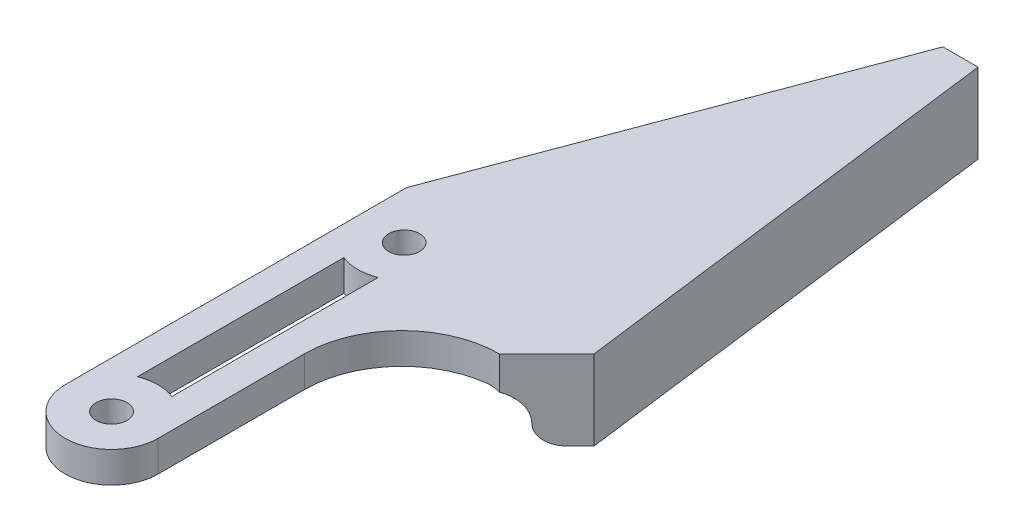
ISO-10303-21;
HEADER;
FILE_DESCRIPTION(('STEP AP214'),'2;1');
FILE_NAME('part.step','',(''),(''),'','','');
FILE_SCHEMA(('AUTOMOTIVE_DESIGN { 1 0 10303 214 1 1 1 1 }'));
ENDSEC;
DATA;
#1=APPLICATION_CONTEXT('core data for automotive mechanical design processes');
#2=APPLICATION_PROTOCOL_DEFINITION('international standard','automotive_design',2000,#1);
#3=PRODUCT_CONTEXT('',#1,'mechanical');
#4=PRODUCT('Part','Part','',(#3));
#5=PRODUCT_RELATED_PRODUCT_CATEGORY('part','',(#4));
#6=PRODUCT_DEFINITION_FORMATION('','',#4);
#7=PRODUCT_DEFINITION_CONTEXT('part definition',#1,'design');
#8=PRODUCT_DEFINITION('design','',#6,#7);
#9=PRODUCT_DEFINITION_SHAPE('','',#8);
#10=(LENGTH_UNIT() NAMED_UNIT(*) SI_UNIT(.MILLI.,.METRE.));
#11=(NAMED_UNIT(*) PLANE_ANGLE_UNIT() SI_UNIT($,.RADIAN.));
#12=(NAMED_UNIT(*) SI_UNIT($,.STERADIAN.) SOLID_ANGLE_UNIT());
#13=UNCERTAINTY_MEASURE_WITH_UNIT(LENGTH_MEASURE(1.E-05),#10,'distance_accuracy_value','');
#14=(GEOMETRIC_REPRESENTATION_CONTEXT(3) GLOBAL_UNCERTAINTY_ASSIGNED_CONTEXT((#13)) GLOBAL_UNIT_ASSIGNED_CONTEXT((#10,
#11,#12)) REPRESENTATION_CONTEXT('',''));
#15=CARTESIAN_POINT('',(0.,0.,0.));
#16=DIRECTION('',(0.,0.,1.));
#17=DIRECTION('',(1.,0.,0.));
#18=AXIS2_PLACEMENT_3D('',#15,#16,#17);
#19=CARTESIAN_POINT('',(7.025,3.175,20.));
#20=DIRECTION('',(0.,-1.,0.));
#21=DIRECTION('',(0.,0.,-1.));
#22=AXIS2_PLACEMENT_3D('',#19,#20,#21);
#23=PLANE('',#22);
#24=CARTESIAN_POINT('',(-7.7375,3.175,35.));
#25=DIRECTION('',(0.,1.,0.));
#26=DIRECTION('',(0.,0.,1.));
#27=AXIS2_PLACEMENT_3D('',#24,#25,#26);
#28=CIRCLE('',#27,4.7625);
#29=CARTESIAN_POINT('',(-5.97499999999999,3.175,30.5756356388742));
#30=VERTEX_POINT('',#29);
#31=CARTESIAN_POINT('',(-9.5,3.175,30.5756356388742));
#32=VERTEX_POINT('',#31);
#33=EDGE_CURVE('E179',#30,#32,#28,.T.);
#34=ORIENTED_EDGE('',*,*,#33,.T.);
#35=DIRECTION('',(0.,0.,1.));
#36=VECTOR('',#35,1.);
#37=CARTESIAN_POINT('',(-9.5,3.175,0.));
#38=LINE('',#37,#36);
#39=CARTESIAN_POINT('',(-9.5,3.175,9.42705531363683));
#40=VERTEX_POINT('',#39);
#41=EDGE_CURVE('E188',#40,#32,#38,.T.);
#42=ORIENTED_EDGE('',*,*,#41,.F.);
#43=CARTESIAN_POINT('',(-7.7375,3.175,5.00000000000001));
#44=DIRECTION('',(0.,1.,0.));
#45=DIRECTION('',(0.,0.,1.));
#46=AXIS2_PLACEMENT_3D('',#43,#44,#45);
#47=CIRCLE('',#46,4.76499999999999);
#48=CARTESIAN_POINT('',(-5.97500000000001,3.175,9.42705531363683));
#49=VERTEX_POINT('',#48);
#50=EDGE_CURVE('E185',#40,#49,#47,.T.);
#51=ORIENTED_EDGE('',*,*,#50,.T.);
#52=DIRECTION('',(0.,0.,1.));
#53=VECTOR('',#52,1.);
#54=CARTESIAN_POINT('',(-5.975,3.175,0.));
#55=LINE('',#54,#53);
#56=EDGE_CURVE('E182',#49,#30,#55,.T.);
#57=ORIENTED_EDGE('',*,*,#56,.T.);
#58=EDGE_LOOP('',(#34,#42,#51,#57));
#59=FACE_BOUND('',#58,.T.);
#60=CARTESIAN_POINT('',(-7.7375,3.175,5.00000000000001));
#61=DIRECTION('',(0.,1.,0.));
#62=DIRECTION('',(0.,0.,1.));
#63=AXIS2_PLACEMENT_3D('',#60,#61,#62);
#64=CIRCLE('',#63,1.5875);
#65=CARTESIAN_POINT('',(-7.7375,3.175,6.58750000000001));
#66=VERTEX_POINT('',#65);
#67=EDGE_CURVE('E210',#66,#66,#64,.T.);
#68=ORIENTED_EDGE('',*,*,#67,.F.);
#69=EDGE_LOOP('',(#68));
#70=FACE_BOUND('',#69,.T.);
#71=CARTESIAN_POINT('',(-7.7375,3.175,35.));
#72=DIRECTION('',(0.,1.,0.));
#73=DIRECTION('',(0.,0.,1.));
#74=AXIS2_PLACEMENT_3D('',#71,#72,#73);
#75=CIRCLE('',#74,1.5875);
#76=CARTESIAN_POINT('',(-7.7375,3.175,36.5875));
#77=VERTEX_POINT('',#76);
#78=EDGE_CURVE('E204',#77,#77,#75,.T.);
#79=ORIENTED_EDGE('',*,*,#78,.F.);
#80=EDGE_LOOP('',(#79));
#81=FACE_BOUND('',#80,.T.);
#82=CARTESIAN_POINT('',(7.025,3.175,20.));
#83=DIRECTION('',(0.,-1.,0.));
#84=DIRECTION('',(0.,0.,-1.));
#85=AXIS2_PLACEMENT_3D('',#82,#83,#84);
#86=CIRCLE('',#85,10.);
#87=CARTESIAN_POINT('',(-2.975,3.175,20.));
#88=VERTEX_POINT('',#87);
#89=CARTESIAN_POINT('',(7.025,3.175,10.));
#90=VERTEX_POINT('',#89);
#91=EDGE_CURVE('E218',#88,#90,#86,.T.);
#92=ORIENTED_EDGE('',*,*,#91,.T.);
#93=DIRECTION('',(-0.707106781186551,0.,0.707106781186544));
#94=VECTOR('',#93,1.);
#95=CARTESIAN_POINT('',(7.025,3.175,10.));
#96=LINE('',#95,#94);
#97=CARTESIAN_POINT('',(11.8787234042553,3.175,5.14627659574474));
#98=VERTEX_POINT('',#97);
#99=EDGE_CURVE('E167',#98,#90,#96,.T.);
#100=ORIENTED_EDGE('',*,*,#99,.F.);
#101=DIRECTION('',(0.126964135465405,0.,0.991907308323476));
#102=VECTOR('',#101,1.);
#103=CARTESIAN_POINT('',(12.5,3.175,10.));
#104=LINE('',#103,#102);
#105=CARTESIAN_POINT('',(6.09999999999999,3.175,-40.));
#106=VERTEX_POINT('',#105);
#107=EDGE_CURVE('E152',#106,#98,#104,.T.);
#108=ORIENTED_EDGE('',*,*,#107,.F.);
#109=DIRECTION('',(-1.,0.,0.));
#110=VECTOR('',#109,1.);
#111=CARTESIAN_POINT('',(12.5,3.175,-40.));
#112=LINE('',#111,#110);
#113=CARTESIAN_POINT('',(2.49999999999999,3.175,-40.));
#114=VERTEX_POINT('',#113);
#115=EDGE_CURVE('E222',#106,#114,#112,.T.);
#116=ORIENTED_EDGE('',*,*,#115,.T.);
#117=DIRECTION('',(-0.351123441588392,0.,0.936329177569045));
#118=VECTOR('',#117,1.);
#119=CARTESIAN_POINT('',(2.49999999999999,3.175,-40.));
#120=LINE('',#119,#118);
#121=CARTESIAN_POINT('',(-12.5,3.175,0.));
#122=VERTEX_POINT('',#121);
#123=EDGE_CURVE('E224',#114,#122,#120,.T.);
#124=ORIENTED_EDGE('',*,*,#123,.T.);
#125=DIRECTION('',(0.,0.,1.));
#126=VECTOR('',#125,1.);
#127=CARTESIAN_POINT('',(-12.5,3.175,0.));
#128=LINE('',#127,#126);
#129=CARTESIAN_POINT('',(-12.5,3.175,35.));
#130=VERTEX_POINT('',#129);
#131=EDGE_CURVE('E226',#122,#130,#128,.T.);
#132=ORIENTED_EDGE('',*,*,#131,.T.);
#133=CARTESIAN_POINT('',(-7.7375,3.175,35.));
#134=DIRECTION('',(0.,1.,0.));
#135=DIRECTION('',(0.,0.,1.));
#136=AXIS2_PLACEMENT_3D('',#133,#134,#135);
#137=CIRCLE('',#136,4.76250000000001);
#138=CARTESIAN_POINT('',(-2.975,3.175,35.));
#139=VERTEX_POINT('',#138);
#140=EDGE_CURVE('E173',#130,#139,#137,.T.);
#141=ORIENTED_EDGE('',*,*,#140,.T.);
#142=DIRECTION('',(0.,0.,-1.));
#143=VECTOR('',#142,1.);
#144=CARTESIAN_POINT('',(-2.975,3.175,40.));
#145=LINE('',#144,#143);
#146=EDGE_CURVE('E216',#139,#88,#145,.T.);
#147=ORIENTED_EDGE('',*,*,#146,.T.);
#148=EDGE_LOOP('',(#92,#100,#108,#116,#124,#132,#141,#147));
#149=FACE_BOUND('',#148,.T.);
#150=ADVANCED_FACE('F32',(#59,#70,#81,#149),#23,.F.);
#151=CARTESIAN_POINT('',(7.025,0.,20.));
#152=DIRECTION('',(0.,-1.,0.));
#153=DIRECTION('',(0.,0.,-1.));
#154=AXIS2_PLACEMENT_3D('',#151,#152,#153);
#155=PLANE('',#154);
#156=DIRECTION('',(-0.351123441588392,0.,0.936329177569045));
#157=VECTOR('',#156,1.);
#158=CARTESIAN_POINT('',(2.49999999999999,0.,-40.));
#159=LINE('',#158,#157);
#160=CARTESIAN_POINT('',(0.245171854133339,0.,-33.9871249443556));
#161=VERTEX_POINT('',#160);
#162=CARTESIAN_POINT('',(-12.5,0.,0.));
#163=VERTEX_POINT('',#162);
#164=EDGE_CURVE('E234',#161,#163,#159,.T.);
#165=ORIENTED_EDGE('',*,*,#164,.F.);
#166=DIRECTION('',(-0.126964135465405,0.,-0.991907308323476));
#167=VECTOR('',#166,1.);
#168=CARTESIAN_POINT('',(5.71151211758277,0.,8.71865836384306));
#169=LINE('',#168,#167);
#170=CARTESIAN_POINT('',(5.88388487421906,0.,10.065320525064));
#171=VERTEX_POINT('',#170);
#172=EDGE_CURVE('E270',#161,#171,#169,.F.);
#173=ORIENTED_EDGE('',*,*,#172,.T.);
#174=CARTESIAN_POINT('',(7.025,0.,20.));
#175=DIRECTION('',(0.,-1.,0.));
#176=DIRECTION('',(0.,0.,-1.));
#177=AXIS2_PLACEMENT_3D('',#174,#175,#176);
#178=CIRCLE('',#177,10.);
#179=CARTESIAN_POINT('',(-2.975,0.,20.));
#180=VERTEX_POINT('',#179);
#181=EDGE_CURVE('E231',#180,#171,#178,.T.);
#182=ORIENTED_EDGE('',*,*,#181,.F.);
#183=DIRECTION('',(0.,0.,-1.));
#184=VECTOR('',#183,1.);
#185=CARTESIAN_POINT('',(-2.975,0.,40.));
#186=LINE('',#185,#184);
#187=CARTESIAN_POINT('',(-2.975,0.,35.));
#188=VERTEX_POINT('',#187);
#189=EDGE_CURVE('E213',#188,#180,#186,.T.);
#190=ORIENTED_EDGE('',*,*,#189,.F.);
#191=CARTESIAN_POINT('',(-7.7375,0.,35.));
#192=DIRECTION('',(0.,-1.,0.));
#193=DIRECTION('',(0.,0.,-1.));
#194=AXIS2_PLACEMENT_3D('',#191,#192,#193);
#195=CIRCLE('',#194,4.76250000000001);
#196=CARTESIAN_POINT('',(-12.5,0.,35.));
#197=VERTEX_POINT('',#196);
#198=EDGE_CURVE('E176',#188,#197,#195,.T.);
#199=ORIENTED_EDGE('',*,*,#198,.T.);
#200=DIRECTION('',(0.,0.,1.));
#201=VECTOR('',#200,1.);
#202=CARTESIAN_POINT('',(-12.5,0.,0.));
#203=LINE('',#202,#201);
#204=EDGE_CURVE('E219',#163,#197,#203,.T.);
#205=ORIENTED_EDGE('',*,*,#204,.F.);
#206=EDGE_LOOP('',(#165,#173,#182,#190,#199,#205));
#207=FACE_BOUND('',#206,.T.);
#208=DIRECTION('',(0.,0.,-1.));
#209=VECTOR('',#208,1.);
#210=CARTESIAN_POINT('',(-9.5,0.,20.));
#211=LINE('',#210,#209);
#212=CARTESIAN_POINT('',(-9.5,0.,30.5756356388742));
#213=VERTEX_POINT('',#212);
#214=CARTESIAN_POINT('',(-9.5,0.,9.42705531363683));
#215=VERTEX_POINT('',#214);
#216=EDGE_CURVE('E253',#213,#215,#211,.T.);
#217=ORIENTED_EDGE('',*,*,#216,.F.);
#218=CARTESIAN_POINT('',(-7.7375,0.,35.));
#219=DIRECTION('',(0.,-1.,0.));
#220=DIRECTION('',(0.,0.,-1.));
#221=AXIS2_PLACEMENT_3D('',#218,#219,#220);
#222=CIRCLE('',#221,4.7625);
#223=CARTESIAN_POINT('',(-5.97499999999999,0.,30.5756356388742));
#224=VERTEX_POINT('',#223);
#225=EDGE_CURVE('E255',#213,#224,#222,.T.);
#226=ORIENTED_EDGE('',*,*,#225,.T.);
#227=DIRECTION('',(0.,0.,-1.));
#228=VECTOR('',#227,1.);
#229=CARTESIAN_POINT('',(-5.97499999999999,0.,20.));
#230=LINE('',#229,#228);
#231=CARTESIAN_POINT('',(-5.975,0.,9.42705531363683));
#232=VERTEX_POINT('',#231);
#233=EDGE_CURVE('E247',#224,#232,#230,.T.);
#234=ORIENTED_EDGE('',*,*,#233,.T.);
#235=CARTESIAN_POINT('',(-7.7375,0.,5.00000000000001));
#236=DIRECTION('',(0.,-1.,0.));
#237=DIRECTION('',(0.,0.,-1.));
#238=AXIS2_PLACEMENT_3D('',#235,#236,#237);
#239=CIRCLE('',#238,4.76499999999999);
#240=EDGE_CURVE('E250',#232,#215,#239,.T.);
#241=ORIENTED_EDGE('',*,*,#240,.T.);
#242=EDGE_LOOP('',(#217,#226,#234,#241));
#243=FACE_BOUND('',#242,.T.);
#244=CARTESIAN_POINT('',(-7.7375,0.,5.00000000000001));
#245=DIRECTION('',(0.,1.,0.));
#246=DIRECTION('',(0.,0.,1.));
#247=AXIS2_PLACEMENT_3D('',#244,#245,#246);
#248=CIRCLE('',#247,1.5875);
#249=CARTESIAN_POINT('',(-7.7375,0.,6.58750000000001));
#250=VERTEX_POINT('',#249);
#251=EDGE_CURVE('E207',#250,#250,#248,.T.);
#252=ORIENTED_EDGE('',*,*,#251,.T.);
#253=EDGE_LOOP('',(#252));
#254=FACE_BOUND('',#253,.T.);
#255=CARTESIAN_POINT('',(-7.7375,0.,35.));
#256=DIRECTION('',(0.,1.,0.));
#257=DIRECTION('',(0.,0.,1.));
#258=AXIS2_PLACEMENT_3D('',#255,#256,#257);
#259=CIRCLE('',#258,1.5875);
#260=CARTESIAN_POINT('',(-7.7375,0.,36.5875));
#261=VERTEX_POINT('',#260);
#262=EDGE_CURVE('E203',#261,#261,#259,.T.);
#263=ORIENTED_EDGE('',*,*,#262,.T.);
#264=EDGE_LOOP('',(#263));
#265=FACE_BOUND('',#264,.T.);
#266=ADVANCED_FACE('F288',(#207,#243,#254,#265),#155,.T.);
#267=CARTESIAN_POINT('',(-2.975,3.175,40.));
#268=DIRECTION('',(-1.,0.,0.));
#269=DIRECTION('',(0.,0.,1.));
#270=AXIS2_PLACEMENT_3D('',#267,#268,#269);
#271=PLANE('',#270);
#272=DIRECTION('',(0.,1.,0.));
#273=VECTOR('',#272,1.);
#274=CARTESIAN_POINT('',(-2.975,-6.825,35.));
#275=LINE('',#274,#273);
#276=EDGE_CURVE('E171',#188,#139,#275,.T.);
#277=ORIENTED_EDGE('',*,*,#276,.F.);
#278=ORIENTED_EDGE('',*,*,#189,.T.);
#279=DIRECTION('',(0.,-1.,0.));
#280=VECTOR('',#279,1.);
#281=CARTESIAN_POINT('',(-2.975,3.175,20.));
#282=LINE('',#281,#280);
#283=EDGE_CURVE('E244',#88,#180,#282,.T.);
#284=ORIENTED_EDGE('',*,*,#283,.F.);
#285=ORIENTED_EDGE('',*,*,#146,.F.);
#286=EDGE_LOOP('',(#277,#278,#284,#285));
#287=FACE_BOUND('',#286,.T.);
#288=ADVANCED_FACE('F284',(#287),#271,.F.);
#289=CARTESIAN_POINT('',(7.025,3.175,20.));
#290=DIRECTION('',(0.,-1.,0.));
#291=DIRECTION('',(0.,0.,-1.));
#292=AXIS2_PLACEMENT_3D('',#289,#290,#291);
#293=CYLINDRICAL_SURFACE('',#292,10.);
#294=ORIENTED_EDGE('',*,*,#181,.T.);
#295=CARTESIAN_POINT('',(5.88388487421906,0.,10.065320525064));
#296=CARTESIAN_POINT('',(5.96588606272027,1.137625986778E-05,10.0558915251468));
#297=CARTESIAN_POINT('',(6.04800379245822,-0.0034053608694713,10.0474978101785));
#298=CARTESIAN_POINT('',(6.21189897185825,-0.0170106342431355,10.0327744848225));
#299=CARTESIAN_POINT('',(6.29367626049506,-0.0272020738411193,10.0264457611378));
#300=CARTESIAN_POINT('',(6.4549058933574,-0.0540490688630135,10.015941333621));
#301=CARTESIAN_POINT('',(6.53437434112309,-0.0705952981023657,10.0117318583617));
#302=CARTESIAN_POINT('',(6.69176669525959,-0.109999457262575,10.0052439355956));
#303=CARTESIAN_POINT('',(6.76969158244378,-0.132853231705129,10.0029642207496));
#304=CARTESIAN_POINT('',(6.87659920031877,-0.16887594749007,10.0010559879153));
#305=CARTESIAN_POINT('',(6.90646172187306,-0.179457004448786,10.0006584631609));
#306=CARTESIAN_POINT('',(6.96594441933923,-0.201574961966556,10.0001300417382));
#307=CARTESIAN_POINT('',(6.99556348154664,-0.213114878874891,10.0000000223735));
#308=CARTESIAN_POINT('',(7.025,-0.225111945883672,10.));
#309=B_SPLINE_CURVE_WITH_KNOTS('',3,(#295,#296,#297,#298,#299,#300,#301,#302,#303,#304,#305,
#306,#307,#308),.UNSPECIFIED.,.F.,.F.,(4,2,2,2,2,2,4),(0.,0.247544800111642,0.495195756006995,
0.738764344016492,0.982172847900972,1.07721267551212,1.17256369959051),.UNSPECIFIED.);
#310=CARTESIAN_POINT('',(7.025,-0.225111945883673,10.));
#311=VERTEX_POINT('',#310);
#312=EDGE_CURVE('E42',#171,#311,#309,.T.);
#313=ORIENTED_EDGE('',*,*,#312,.T.);
#314=DIRECTION('',(0.,-1.,0.));
#315=VECTOR('',#314,1.);
#316=CARTESIAN_POINT('',(7.025,3.175,10.));
#317=LINE('',#316,#315);
#318=EDGE_CURVE('E48',#90,#311,#317,.T.);
#319=ORIENTED_EDGE('',*,*,#318,.F.);
#320=ORIENTED_EDGE('',*,*,#91,.F.);
#321=ORIENTED_EDGE('',*,*,#283,.T.);
#322=EDGE_LOOP('',(#294,#313,#319,#320,#321));
#323=FACE_BOUND('',#322,.T.);
#324=ADVANCED_FACE('F278',(#323),#293,.F.);
#325=CARTESIAN_POINT('',(12.5,3.175,-40.));
#326=DIRECTION('',(0.,0.,1.));
#327=DIRECTION('',(1.,0.,0.));
#328=AXIS2_PLACEMENT_3D('',#325,#326,#327);
#329=PLANE('',#328);
#330=DIRECTION('',(-1.,0.,0.));
#331=VECTOR('',#330,1.);
#332=CARTESIAN_POINT('',(6.09999999999999,-5.005,-40.));
#333=LINE('',#332,#331);
#334=CARTESIAN_POINT('',(6.09999999999999,-5.005,-40.));
#335=VERTEX_POINT('',#334);
#336=CARTESIAN_POINT('',(4.51631743532609,-5.005,-40.));
#337=VERTEX_POINT('',#336);
#338=EDGE_CURVE('E159',#335,#337,#333,.T.);
#339=ORIENTED_EDGE('',*,*,#338,.T.);
#340=CARTESIAN_POINT('',(4.51631743532609,-3.005,-40.));
#341=DIRECTION('',(0.,0.,1.));
#342=DIRECTION('',(-1.,0.,0.));
#343=AXIS2_PLACEMENT_3D('',#340,#341,#342);
#344=ELLIPSE('',#343,2.01631743532609,2.);
#345=CARTESIAN_POINT('',(2.49999999999999,-3.005,-40.));
#346=VERTEX_POINT('',#345);
#347=EDGE_CURVE('E265',#337,#346,#344,.F.);
#348=ORIENTED_EDGE('',*,*,#347,.T.);
#349=DIRECTION('',(0.,1.,0.));
#350=VECTOR('',#349,1.);
#351=CARTESIAN_POINT('',(2.49999999999999,-5.005,-40.));
#352=LINE('',#351,#350);
#353=CARTESIAN_POINT('',(2.49999999999999,-3.,-40.));
#354=VERTEX_POINT('',#353);
#355=EDGE_CURVE('E161',#346,#354,#352,.T.);
#356=ORIENTED_EDGE('',*,*,#355,.T.);
#357=DIRECTION('',(0.,-1.,0.));
#358=VECTOR('',#357,1.);
#359=CARTESIAN_POINT('',(2.49999999999999,3.175,-40.));
#360=LINE('',#359,#358);
#361=EDGE_CURVE('E240',#114,#354,#360,.T.);
#362=ORIENTED_EDGE('',*,*,#361,.F.);
#363=ORIENTED_EDGE('',*,*,#115,.F.);
#364=DIRECTION('',(0.,1.,0.));
#365=VECTOR('',#364,1.);
#366=CARTESIAN_POINT('',(6.09999999999999,0.,-40.));
#367=LINE('',#366,#365);
#368=EDGE_CURVE('E201',#335,#106,#367,.T.);
#369=ORIENTED_EDGE('',*,*,#368,.F.);
#370=EDGE_LOOP('',(#339,#348,#356,#362,#363,#369));
#371=FACE_BOUND('',#370,.T.);
#372=ADVANCED_FACE('F283',(#371),#329,.F.);
#373=CARTESIAN_POINT('',(2.49999999999999,3.175,-40.));
#374=DIRECTION('',(0.936329177569044,0.,0.351123441588392));
#375=DIRECTION('',(0.351123441588392,0.,-0.936329177569045));
#376=AXIS2_PLACEMENT_3D('',#373,#374,#375);
#377=PLANE('',#376);
#378=ORIENTED_EDGE('',*,*,#361,.T.);
#379=CARTESIAN_POINT('',(0.245171854133338,-3.,-33.9871249443556));
#380=DIRECTION('',(0.936329177569044,0.,0.351123441588392));
#381=DIRECTION('',(-0.351123441588392,0.,0.936329177569045));
#382=AXIS2_PLACEMENT_3D('',#379,#380,#381);
#383=ELLIPSE('',#382,6.42175337444403,3.);
#384=EDGE_CURVE('E272',#354,#161,#383,.T.);
#385=ORIENTED_EDGE('',*,*,#384,.T.);
#386=ORIENTED_EDGE('',*,*,#164,.T.);
#387=DIRECTION('',(0.,-1.,0.));
#388=VECTOR('',#387,1.);
#389=CARTESIAN_POINT('',(-12.5,3.175,0.));
#390=LINE('',#389,#388);
#391=EDGE_CURVE('E229',#122,#163,#390,.T.);
#392=ORIENTED_EDGE('',*,*,#391,.F.);
#393=ORIENTED_EDGE('',*,*,#123,.F.);
#394=EDGE_LOOP('',(#378,#385,#386,#392,#393));
#395=FACE_BOUND('',#394,.T.);
#396=ADVANCED_FACE('F316',(#395),#377,.F.);
#397=CARTESIAN_POINT('',(-12.5,3.175,0.));
#398=DIRECTION('',(1.,0.,0.));
#399=DIRECTION('',(0.,0.,-1.));
#400=AXIS2_PLACEMENT_3D('',#397,#398,#399);
#401=PLANE('',#400);
#402=ORIENTED_EDGE('',*,*,#204,.T.);
#403=DIRECTION('',(0.,1.,0.));
#404=VECTOR('',#403,1.);
#405=CARTESIAN_POINT('',(-12.5,-6.825,35.));
#406=LINE('',#405,#404);
#407=EDGE_CURVE('E154',#197,#130,#406,.T.);
#408=ORIENTED_EDGE('',*,*,#407,.T.);
#409=ORIENTED_EDGE('',*,*,#131,.F.);
#410=ORIENTED_EDGE('',*,*,#391,.T.);
#411=EDGE_LOOP('',(#402,#408,#409,#410));
#412=FACE_BOUND('',#411,.T.);
#413=ADVANCED_FACE('F314',(#412),#401,.F.);
#414=CARTESIAN_POINT('',(-7.7375,3.175,5.00000000000001));
#415=DIRECTION('',(0.,-1.,0.));
#416=DIRECTION('',(0.,0.,-1.));
#417=AXIS2_PLACEMENT_3D('',#414,#415,#416);
#418=CYLINDRICAL_SURFACE('',#417,1.5875);
#419=ORIENTED_EDGE('',*,*,#67,.T.);
#420=EDGE_LOOP('',(#419));
#421=FACE_BOUND('',#420,.T.);
#422=ORIENTED_EDGE('',*,*,#251,.F.);
#423=EDGE_LOOP('',(#422));
#424=FACE_BOUND('',#423,.T.);
#425=ADVANCED_FACE('F311',(#421,#424),#418,.F.);
#426=CARTESIAN_POINT('',(-7.7375,3.175,35.));
#427=DIRECTION('',(0.,-1.,0.));
#428=DIRECTION('',(0.,0.,-1.));
#429=AXIS2_PLACEMENT_3D('',#426,#427,#428);
#430=CYLINDRICAL_SURFACE('',#429,1.5875);
#431=ORIENTED_EDGE('',*,*,#78,.T.);
#432=EDGE_LOOP('',(#431));
#433=FACE_BOUND('',#432,.T.);
#434=ORIENTED_EDGE('',*,*,#262,.F.);
#435=EDGE_LOOP('',(#434));
#436=FACE_BOUND('',#435,.T.);
#437=ADVANCED_FACE('F374',(#433,#436),#430,.F.);
#438=CARTESIAN_POINT('',(12.5,0.,10.));
#439=DIRECTION('',(-0.991907308323476,0.,0.126964135465405));
#440=DIRECTION('',(0.126964135465405,0.,0.991907308323476));
#441=AXIS2_PLACEMENT_3D('',#438,#439,#440);
#442=PLANE('',#441);
#443=ORIENTED_EDGE('',*,*,#107,.T.);
#444=DIRECTION('',(0.,-1.,0.));
#445=VECTOR('',#444,1.);
#446=CARTESIAN_POINT('',(11.8787234042553,0.,5.14627659574474));
#447=LINE('',#446,#445);
#448=CARTESIAN_POINT('',(11.8787234042553,-5.005,5.14627659574474));
#449=VERTEX_POINT('',#448);
#450=EDGE_CURVE('E139',#98,#449,#447,.T.);
#451=ORIENTED_EDGE('',*,*,#450,.T.);
#452=DIRECTION('',(-0.126964135465405,0.,-0.991907308323475));
#453=VECTOR('',#452,1.);
#454=CARTESIAN_POINT('',(11.8787234042553,-5.005,5.14627659574474));
#455=LINE('',#454,#453);
#456=EDGE_CURVE('E145',#449,#335,#455,.T.);
#457=ORIENTED_EDGE('',*,*,#456,.T.);
#458=ORIENTED_EDGE('',*,*,#368,.T.);
#459=EDGE_LOOP('',(#443,#451,#457,#458));
#460=FACE_BOUND('',#459,.T.);
#461=ADVANCED_FACE('F150',(#460),#442,.F.);
#462=CARTESIAN_POINT('',(-7.7375,-6.825,35.));
#463=DIRECTION('',(0.,1.,0.));
#464=DIRECTION('',(0.,0.,1.));
#465=AXIS2_PLACEMENT_3D('',#462,#463,#464);
#466=CYLINDRICAL_SURFACE('',#465,4.7625);
#467=DIRECTION('',(0.,1.,0.));
#468=VECTOR('',#467,1.);
#469=CARTESIAN_POINT('',(-9.5,-6.825,30.5756356388742));
#470=LINE('',#469,#468);
#471=EDGE_CURVE('E192',#213,#32,#470,.T.);
#472=ORIENTED_EDGE('',*,*,#471,.T.);
#473=ORIENTED_EDGE('',*,*,#33,.F.);
#474=DIRECTION('',(0.,1.,0.));
#475=VECTOR('',#474,1.);
#476=CARTESIAN_POINT('',(-5.97499999999999,-6.825,30.5756356388742));
#477=LINE('',#476,#475);
#478=EDGE_CURVE('E191',#224,#30,#477,.T.);
#479=ORIENTED_EDGE('',*,*,#478,.F.);
#480=ORIENTED_EDGE('',*,*,#225,.F.);
#481=EDGE_LOOP('',(#472,#473,#479,#480));
#482=FACE_BOUND('',#481,.T.);
#483=ADVANCED_FACE('F365',(#482),#466,.T.);
#484=CARTESIAN_POINT('',(-9.5,-6.825,0.));
#485=DIRECTION('',(-1.,0.,0.));
#486=DIRECTION('',(0.,0.,1.));
#487=AXIS2_PLACEMENT_3D('',#484,#485,#486);
#488=PLANE('',#487);
#489=ORIENTED_EDGE('',*,*,#216,.T.);
#490=DIRECTION('',(0.,1.,0.));
#491=VECTOR('',#490,1.);
#492=CARTESIAN_POINT('',(-9.5,-6.825,9.42705531363683));
#493=LINE('',#492,#491);
#494=EDGE_CURVE('E194',#215,#40,#493,.T.);
#495=ORIENTED_EDGE('',*,*,#494,.T.);
#496=ORIENTED_EDGE('',*,*,#41,.T.);
#497=ORIENTED_EDGE('',*,*,#471,.F.);
#498=EDGE_LOOP('',(#489,#495,#496,#497));
#499=FACE_BOUND('',#498,.T.);
#500=ADVANCED_FACE('F362',(#499),#488,.F.);
#501=CARTESIAN_POINT('',(-7.7375,-6.825,5.00000000000001));
#502=DIRECTION('',(0.,1.,0.));
#503=DIRECTION('',(0.,0.,1.));
#504=AXIS2_PLACEMENT_3D('',#501,#502,#503);
#505=CYLINDRICAL_SURFACE('',#504,4.76499999999999);
#506=DIRECTION('',(0.,1.,0.));
#507=VECTOR('',#506,1.);
#508=CARTESIAN_POINT('',(-5.97500000000001,-6.825,9.42705531363683));
#509=LINE('',#508,#507);
#510=EDGE_CURVE('E196',#232,#49,#509,.T.);
#511=ORIENTED_EDGE('',*,*,#510,.T.);
#512=ORIENTED_EDGE('',*,*,#50,.F.);
#513=ORIENTED_EDGE('',*,*,#494,.F.);
#514=ORIENTED_EDGE('',*,*,#240,.F.);
#515=EDGE_LOOP('',(#511,#512,#513,#514));
#516=FACE_BOUND('',#515,.T.);
#517=ADVANCED_FACE('F357',(#516),#505,.T.);
#518=CARTESIAN_POINT('',(-5.975,-6.825,0.));
#519=DIRECTION('',(-1.,0.,0.));
#520=DIRECTION('',(0.,0.,1.));
#521=AXIS2_PLACEMENT_3D('',#518,#519,#520);
#522=PLANE('',#521);
#523=ORIENTED_EDGE('',*,*,#478,.T.);
#524=ORIENTED_EDGE('',*,*,#56,.F.);
#525=ORIENTED_EDGE('',*,*,#510,.F.);
#526=ORIENTED_EDGE('',*,*,#233,.F.);
#527=EDGE_LOOP('',(#523,#524,#525,#526));
#528=FACE_BOUND('',#527,.T.);
#529=ADVANCED_FACE('F350',(#528),#522,.T.);
#530=CARTESIAN_POINT('',(-7.7375,-6.825,35.));
#531=DIRECTION('',(0.,1.,0.));
#532=DIRECTION('',(0.,0.,1.));
#533=AXIS2_PLACEMENT_3D('',#530,#531,#532);
#534=CYLINDRICAL_SURFACE('',#533,4.76250000000001);
#535=ORIENTED_EDGE('',*,*,#276,.T.);
#536=ORIENTED_EDGE('',*,*,#140,.F.);
#537=ORIENTED_EDGE('',*,*,#407,.F.);
#538=ORIENTED_EDGE('',*,*,#198,.F.);
#539=EDGE_LOOP('',(#535,#536,#537,#538));
#540=FACE_BOUND('',#539,.T.);
#541=ADVANCED_FACE('F348',(#540),#534,.T.);
#542=CARTESIAN_POINT('',(7.025,-6.825,10.));
#543=DIRECTION('',(-0.707106781186544,0.,-0.707106781186551));
#544=DIRECTION('',(-0.707106781186551,0.,0.707106781186544));
#545=AXIS2_PLACEMENT_3D('',#542,#543,#544);
#546=PLANE('',#545);
#547=DIRECTION('',(0.,1.,0.));
#548=VECTOR('',#547,1.);
#549=CARTESIAN_POINT('',(8.6872340425532,-5.005,8.33776595744686));
#550=LINE('',#549,#548);
#551=CARTESIAN_POINT('',(8.6872340425532,-3.005,8.33776595744686));
#552=VERTEX_POINT('',#551);
#553=CARTESIAN_POINT('',(8.6872340425532,-3.,8.33776595744686));
#554=VERTEX_POINT('',#553);
#555=EDGE_CURVE('E164',#552,#554,#550,.T.);
#556=ORIENTED_EDGE('',*,*,#555,.F.);
#557=CARTESIAN_POINT('',(10.4747494994026,-3.005,6.55025050059747));
#558=DIRECTION('',(-0.707106781186544,0.,-0.707106781186551));
#559=DIRECTION('',(0.707106781186551,0.,-0.707106781186544));
#560=AXIS2_PLACEMENT_3D('',#557,#558,#559);
#561=ELLIPSE('',#560,2.52792860202791,2.);
#562=CARTESIAN_POINT('',(10.4747494994026,-5.005,6.55025050059749));
#563=VERTEX_POINT('',#562);
#564=EDGE_CURVE('E141',#552,#563,#561,.F.);
#565=ORIENTED_EDGE('',*,*,#564,.T.);
#566=DIRECTION('',(0.707106781186548,0.,-0.707106781186547));
#567=VECTOR('',#566,1.);
#568=CARTESIAN_POINT('',(8.6872340425532,-5.005,8.33776595744686));
#569=LINE('',#568,#567);
#570=EDGE_CURVE('E135',#563,#449,#569,.T.);
#571=ORIENTED_EDGE('',*,*,#570,.T.);
#572=ORIENTED_EDGE('',*,*,#450,.F.);
#573=ORIENTED_EDGE('',*,*,#99,.T.);
#574=ORIENTED_EDGE('',*,*,#318,.T.);
#575=CARTESIAN_POINT('',(6.00596085727913,-3.,11.0190391427209));
#576=DIRECTION('',(-0.707106781186544,0.,-0.707106781186551));
#577=DIRECTION('',(-0.707106781186551,0.,0.707106781186544));
#578=AXIS2_PLACEMENT_3D('',#575,#576,#577);
#579=ELLIPSE('',#578,3.79189290304187,3.);
#580=EDGE_CURVE('E11',#311,#554,#579,.T.);
#581=ORIENTED_EDGE('',*,*,#580,.T.);
#582=EDGE_LOOP('',(#556,#565,#571,#572,#573,#574,#581));
#583=FACE_BOUND('',#582,.T.);
#584=ADVANCED_FACE('F138',(#583),#546,.F.);
#585=CARTESIAN_POINT('',(2.49999999999999,-5.005,-40.));
#586=DIRECTION('',(-0.991907308323475,0.,0.126964135465405));
#587=DIRECTION('',(0.126964135465405,0.,0.991907308323476));
#588=AXIS2_PLACEMENT_3D('',#585,#586,#587);
#589=PLANE('',#588);
#590=ORIENTED_EDGE('',*,*,#555,.T.);
#591=DIRECTION('',(-0.126964135465405,0.,-0.991907308323476));
#592=VECTOR('',#591,1.);
#593=CARTESIAN_POINT('',(2.49999999999999,-3.,-40.));
#594=LINE('',#593,#592);
#595=EDGE_CURVE('E267',#554,#354,#594,.T.);
#596=ORIENTED_EDGE('',*,*,#595,.T.);
#597=ORIENTED_EDGE('',*,*,#355,.F.);
#598=DIRECTION('',(0.126964135465405,0.,0.991907308323476));
#599=VECTOR('',#598,1.);
#600=CARTESIAN_POINT('',(8.6872340425532,-3.005,8.33776595744687));
#601=LINE('',#600,#599);
#602=EDGE_CURVE('E153',#346,#552,#601,.T.);
#603=ORIENTED_EDGE('',*,*,#602,.T.);
#604=EDGE_LOOP('',(#590,#596,#597,#603));
#605=FACE_BOUND('',#604,.T.);
#606=ADVANCED_FACE('F298',(#605),#589,.T.);
#607=CARTESIAN_POINT('',(0.,-5.005,0.));
#608=DIRECTION('',(0.,1.,0.));
#609=DIRECTION('',(0.,0.,1.));
#610=AXIS2_PLACEMENT_3D('',#607,#608,#609);
#611=PLANE('',#610);
#612=ORIENTED_EDGE('',*,*,#570,.F.);
#613=DIRECTION('',(0.126964135465405,0.,0.991907308323476));
#614=VECTOR('',#613,1.);
#615=CARTESIAN_POINT('',(4.48381461664694,-5.005,-40.2539282709308));
#616=LINE('',#615,#614);
#617=EDGE_CURVE('E263',#563,#337,#616,.F.);
#618=ORIENTED_EDGE('',*,*,#617,.T.);
#619=ORIENTED_EDGE('',*,*,#338,.F.);
#620=ORIENTED_EDGE('',*,*,#456,.F.);
#621=EDGE_LOOP('',(#612,#618,#619,#620));
#622=FACE_BOUND('',#621,.T.);
#623=ADVANCED_FACE('F157',(#622),#611,.F.);
#624=CARTESIAN_POINT('',(4.48381461664694,-3.005,-40.2539282709308));
#625=DIRECTION('',(-0.126964135465405,0.,-0.991907308323476));
#626=DIRECTION('',(-0.991907308323476,0.,0.126964135465405));
#627=AXIS2_PLACEMENT_3D('',#624,#625,#626);
#628=CYLINDRICAL_SURFACE('',#627,2.);
#629=ORIENTED_EDGE('',*,*,#347,.F.);
#630=ORIENTED_EDGE('',*,*,#617,.F.);
#631=ORIENTED_EDGE('',*,*,#564,.F.);
#632=ORIENTED_EDGE('',*,*,#602,.F.);
#633=EDGE_LOOP('',(#629,#630,#631,#632));
#634=FACE_BOUND('',#633,.T.);
#635=ADVANCED_FACE('F290',(#634),#628,.T.);
#636=CARTESIAN_POINT('',(-0.475721924970433,-3.,-39.6191075936038));
#637=DIRECTION('',(0.126964135465405,0.,0.991907308323476));
#638=DIRECTION('',(0.991907308323476,0.,-0.126964135465405));
#639=AXIS2_PLACEMENT_3D('',#636,#637,#638);
#640=CYLINDRICAL_SURFACE('',#639,3.);
#641=ORIENTED_EDGE('',*,*,#312,.F.);
#642=ORIENTED_EDGE('',*,*,#172,.F.);
#643=ORIENTED_EDGE('',*,*,#384,.F.);
#644=ORIENTED_EDGE('',*,*,#595,.F.);
#645=ORIENTED_EDGE('',*,*,#580,.F.);
#646=EDGE_LOOP('',(#641,#642,#643,#644,#645));
#647=FACE_BOUND('',#646,.T.);
#648=ADVANCED_FACE('F34',(#647),#640,.F.);
#649=CLOSED_SHELL('',(#150,#266,#288,#324,#372,#396,#413,#425,#437,#461,#483,#500,#517,#529,
#541,#584,#606,#623,#635,#648));
#650=MANIFOLD_SOLID_BREP('B2',#649);
#651=ADVANCED_BREP_SHAPE_REPRESENTATION('',(#18,#650),#14);
#652=SHAPE_DEFINITION_REPRESENTATION(#9,#651);
ENDSEC;
END-ISO-10303-21;
